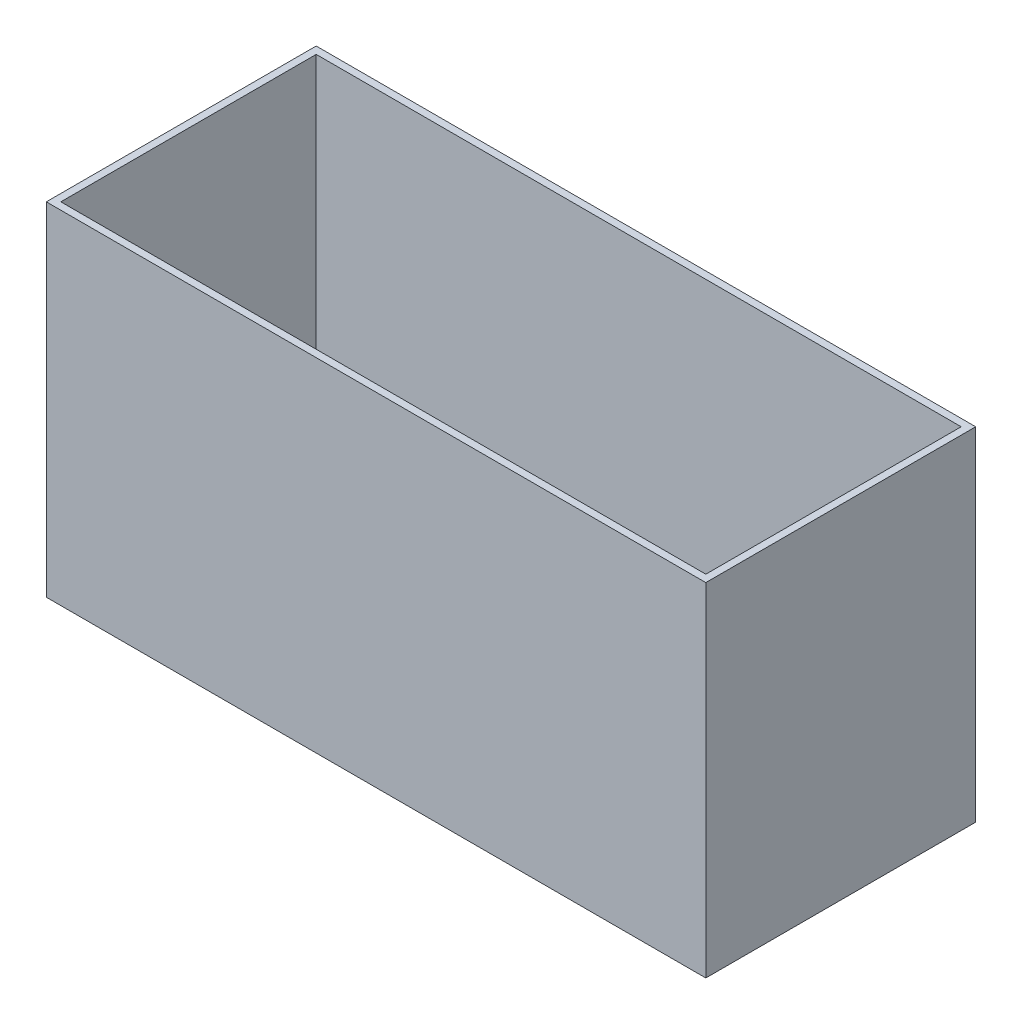
ISO-10303-21;
HEADER;
FILE_DESCRIPTION(('STEP AP214'),'2;1');
FILE_NAME('part.step','',(''),(''),'','','');
FILE_SCHEMA(('AUTOMOTIVE_DESIGN { 1 0 10303 214 1 1 1 1 }'));
ENDSEC;
DATA;
#1=APPLICATION_CONTEXT('core data for automotive mechanical design processes');
#2=APPLICATION_PROTOCOL_DEFINITION('international standard','automotive_design',2000,#1);
#3=PRODUCT_CONTEXT('',#1,'mechanical');
#4=PRODUCT('Part','Part','',(#3));
#5=PRODUCT_RELATED_PRODUCT_CATEGORY('part','',(#4));
#6=PRODUCT_DEFINITION_FORMATION('','',#4);
#7=PRODUCT_DEFINITION_CONTEXT('part definition',#1,'design');
#8=PRODUCT_DEFINITION('design','',#6,#7);
#9=PRODUCT_DEFINITION_SHAPE('','',#8);
#10=(LENGTH_UNIT() NAMED_UNIT(*) SI_UNIT(.MILLI.,.METRE.));
#11=(NAMED_UNIT(*) PLANE_ANGLE_UNIT() SI_UNIT($,.RADIAN.));
#12=(NAMED_UNIT(*) SI_UNIT($,.STERADIAN.) SOLID_ANGLE_UNIT());
#13=UNCERTAINTY_MEASURE_WITH_UNIT(LENGTH_MEASURE(1.E-05),#10,'distance_accuracy_value','');
#14=(GEOMETRIC_REPRESENTATION_CONTEXT(3) GLOBAL_UNCERTAINTY_ASSIGNED_CONTEXT((#13)) GLOBAL_UNIT_ASSIGNED_CONTEXT((#10,
#11,#12)) REPRESENTATION_CONTEXT('',''));
#15=CARTESIAN_POINT('',(0.,0.,0.));
#16=DIRECTION('',(0.,0.,1.));
#17=DIRECTION('',(1.,0.,0.));
#18=AXIS2_PLACEMENT_3D('',#15,#16,#17);
#19=CARTESIAN_POINT('',(0.,10.,0.));
#20=DIRECTION('',(0.,-1.,0.));
#21=DIRECTION('',(0.,0.,-1.));
#22=AXIS2_PLACEMENT_3D('',#19,#20,#21);
#23=PLANE('',#22);
#24=DIRECTION('',(0.,0.,-1.));
#25=VECTOR('',#24,1.);
#26=CARTESIAN_POINT('',(-444.5,10.,0.));
#27=LINE('',#26,#25);
#28=CARTESIAN_POINT('',(-444.5,10.0000000000002,176.));
#29=VERTEX_POINT('',#28);
#30=CARTESIAN_POINT('',(-444.5,10.0000000000002,-176.));
#31=VERTEX_POINT('',#30);
#32=EDGE_CURVE('E130',#29,#31,#27,.T.);
#33=ORIENTED_EDGE('',*,*,#32,.F.);
#34=DIRECTION('',(-1.,0.,0.));
#35=VECTOR('',#34,1.);
#36=CARTESIAN_POINT('',(0.,10.,176.));
#37=LINE('',#36,#35);
#38=CARTESIAN_POINT('',(444.5,10.0000000000002,176.));
#39=VERTEX_POINT('',#38);
#40=EDGE_CURVE('E188',#39,#29,#37,.T.);
#41=ORIENTED_EDGE('',*,*,#40,.F.);
#42=DIRECTION('',(0.,0.,1.));
#43=VECTOR('',#42,1.);
#44=CARTESIAN_POINT('',(444.5,10.,0.));
#45=LINE('',#44,#43);
#46=CARTESIAN_POINT('',(444.5,10.0000000000002,-176.));
#47=VERTEX_POINT('',#46);
#48=EDGE_CURVE('E194',#47,#39,#45,.T.);
#49=ORIENTED_EDGE('',*,*,#48,.F.);
#50=DIRECTION('',(1.,0.,0.));
#51=VECTOR('',#50,1.);
#52=CARTESIAN_POINT('',(0.,10.,-176.));
#53=LINE('',#52,#51);
#54=EDGE_CURVE('E140',#31,#47,#53,.T.);
#55=ORIENTED_EDGE('',*,*,#54,.F.);
#56=EDGE_LOOP('',(#33,#41,#49,#55));
#57=FACE_BOUND('',#56,.T.);
#58=ADVANCED_FACE('F45',(#57),#23,.F.);
#59=CARTESIAN_POINT('',(-454.5,472.,-176.));
#60=DIRECTION('',(0.,0.,-1.));
#61=DIRECTION('',(-1.,0.,0.));
#62=AXIS2_PLACEMENT_3D('',#59,#60,#61);
#63=PLANE('',#62);
#64=DIRECTION('',(0.,-1.,0.));
#65=VECTOR('',#64,1.);
#66=CARTESIAN_POINT('',(-444.5,472.,-176.));
#67=LINE('',#66,#65);
#68=CARTESIAN_POINT('',(-444.5,472.,-176.));
#69=VERTEX_POINT('',#68);
#70=EDGE_CURVE('E127',#69,#31,#67,.T.);
#71=ORIENTED_EDGE('',*,*,#70,.T.);
#72=ORIENTED_EDGE('',*,*,#54,.T.);
#73=DIRECTION('',(0.,-1.,0.));
#74=VECTOR('',#73,1.);
#75=CARTESIAN_POINT('',(444.5,472.,-176.));
#76=LINE('',#75,#74);
#77=CARTESIAN_POINT('',(444.5,472.,-176.));
#78=VERTEX_POINT('',#77);
#79=EDGE_CURVE('E138',#78,#47,#76,.T.);
#80=ORIENTED_EDGE('',*,*,#79,.F.);
#81=DIRECTION('',(1.,0.,0.));
#82=VECTOR('',#81,1.);
#83=CARTESIAN_POINT('',(-454.5,472.,-176.));
#84=LINE('',#83,#82);
#85=EDGE_CURVE('E118',#69,#78,#84,.T.);
#86=ORIENTED_EDGE('',*,*,#85,.F.);
#87=EDGE_LOOP('',(#71,#72,#80,#86));
#88=FACE_BOUND('',#87,.T.);
#89=ADVANCED_FACE('F136',(#88),#63,.F.);
#90=CARTESIAN_POINT('',(-454.5,472.,176.));
#91=DIRECTION('',(0.,0.,1.));
#92=DIRECTION('',(1.,0.,0.));
#93=AXIS2_PLACEMENT_3D('',#90,#91,#92);
#94=PLANE('',#93);
#95=DIRECTION('',(0.,-1.,0.));
#96=VECTOR('',#95,1.);
#97=CARTESIAN_POINT('',(-444.5,472.,176.));
#98=LINE('',#97,#96);
#99=CARTESIAN_POINT('',(-444.5,472.,176.));
#100=VERTEX_POINT('',#99);
#101=EDGE_CURVE('E124',#100,#29,#98,.T.);
#102=ORIENTED_EDGE('',*,*,#101,.F.);
#103=DIRECTION('',(-1.,0.,0.));
#104=VECTOR('',#103,1.);
#105=CARTESIAN_POINT('',(-454.5,472.,176.));
#106=LINE('',#105,#104);
#107=CARTESIAN_POINT('',(444.5,472.,176.));
#108=VERTEX_POINT('',#107);
#109=EDGE_CURVE('E120',#108,#100,#106,.T.);
#110=ORIENTED_EDGE('',*,*,#109,.F.);
#111=DIRECTION('',(0.,-1.,0.));
#112=VECTOR('',#111,1.);
#113=CARTESIAN_POINT('',(444.5,472.,176.));
#114=LINE('',#113,#112);
#115=EDGE_CURVE('E61',#108,#39,#114,.T.);
#116=ORIENTED_EDGE('',*,*,#115,.T.);
#117=ORIENTED_EDGE('',*,*,#40,.T.);
#118=EDGE_LOOP('',(#102,#110,#116,#117));
#119=FACE_BOUND('',#118,.T.);
#120=ADVANCED_FACE('F208',(#119),#94,.F.);
#121=CARTESIAN_POINT('',(454.5,10.,186.));
#122=DIRECTION('',(-1.,0.,0.));
#123=DIRECTION('',(0.,0.,1.));
#124=AXIS2_PLACEMENT_3D('',#121,#122,#123);
#125=PLANE('',#124);
#126=DIRECTION('',(0.,0.,-1.));
#127=VECTOR('',#126,1.);
#128=CARTESIAN_POINT('',(454.5,0.,186.));
#129=LINE('',#128,#127);
#130=CARTESIAN_POINT('',(454.5,0.,186.));
#131=VERTEX_POINT('',#130);
#132=CARTESIAN_POINT('',(454.5,0.,-186.));
#133=VERTEX_POINT('',#132);
#134=EDGE_CURVE('E145',#131,#133,#129,.T.);
#135=ORIENTED_EDGE('',*,*,#134,.T.);
#136=DIRECTION('',(0.,-1.,0.));
#137=VECTOR('',#136,1.);
#138=CARTESIAN_POINT('',(454.5,10.,-186.));
#139=LINE('',#138,#137);
#140=CARTESIAN_POINT('',(454.5,472.,-186.));
#141=VERTEX_POINT('',#140);
#142=EDGE_CURVE('E11',#141,#133,#139,.T.);
#143=ORIENTED_EDGE('',*,*,#142,.F.);
#144=DIRECTION('',(0.,0.,-1.));
#145=VECTOR('',#144,1.);
#146=CARTESIAN_POINT('',(454.5,472.,-176.));
#147=LINE('',#146,#145);
#148=CARTESIAN_POINT('',(454.5,472.,186.));
#149=VERTEX_POINT('',#148);
#150=EDGE_CURVE('E182',#149,#141,#147,.T.);
#151=ORIENTED_EDGE('',*,*,#150,.F.);
#152=DIRECTION('',(0.,-1.,0.));
#153=VECTOR('',#152,1.);
#154=CARTESIAN_POINT('',(454.5,10.,186.));
#155=LINE('',#154,#153);
#156=EDGE_CURVE('E161',#149,#131,#155,.T.);
#157=ORIENTED_EDGE('',*,*,#156,.T.);
#158=EDGE_LOOP('',(#135,#143,#151,#157));
#159=FACE_BOUND('',#158,.T.);
#160=ADVANCED_FACE('F47',(#159),#125,.F.);
#161=CARTESIAN_POINT('',(-454.5,10.,-186.));
#162=DIRECTION('',(0.,0.,1.));
#163=DIRECTION('',(1.,0.,0.));
#164=AXIS2_PLACEMENT_3D('',#161,#162,#163);
#165=PLANE('',#164);
#166=DIRECTION('',(-1.,0.,0.));
#167=VECTOR('',#166,1.);
#168=CARTESIAN_POINT('',(-454.5,0.,-186.));
#169=LINE('',#168,#167);
#170=CARTESIAN_POINT('',(-454.5,0.,-186.));
#171=VERTEX_POINT('',#170);
#172=EDGE_CURVE('E153',#133,#171,#169,.T.);
#173=ORIENTED_EDGE('',*,*,#172,.T.);
#174=DIRECTION('',(0.,-1.,0.));
#175=VECTOR('',#174,1.);
#176=CARTESIAN_POINT('',(-454.5,10.,-186.));
#177=LINE('',#176,#175);
#178=CARTESIAN_POINT('',(-454.5,472.,-186.));
#179=VERTEX_POINT('',#178);
#180=EDGE_CURVE('E54',#179,#171,#177,.T.);
#181=ORIENTED_EDGE('',*,*,#180,.F.);
#182=DIRECTION('',(-1.,0.,0.));
#183=VECTOR('',#182,1.);
#184=CARTESIAN_POINT('',(-454.5,472.,-186.));
#185=LINE('',#184,#183);
#186=EDGE_CURVE('E147',#141,#179,#185,.T.);
#187=ORIENTED_EDGE('',*,*,#186,.F.);
#188=ORIENTED_EDGE('',*,*,#142,.T.);
#189=EDGE_LOOP('',(#173,#181,#187,#188));
#190=FACE_BOUND('',#189,.T.);
#191=ADVANCED_FACE('F200',(#190),#165,.F.);
#192=CARTESIAN_POINT('',(-454.5,10.,186.));
#193=DIRECTION('',(1.,0.,0.));
#194=DIRECTION('',(0.,0.,-1.));
#195=AXIS2_PLACEMENT_3D('',#192,#193,#194);
#196=PLANE('',#195);
#197=DIRECTION('',(0.,-1.,0.));
#198=VECTOR('',#197,1.);
#199=CARTESIAN_POINT('',(-454.5,10.,186.));
#200=LINE('',#199,#198);
#201=CARTESIAN_POINT('',(-454.5,472.,186.));
#202=VERTEX_POINT('',#201);
#203=CARTESIAN_POINT('',(-454.5,0.,186.));
#204=VERTEX_POINT('',#203);
#205=EDGE_CURVE('E164',#202,#204,#200,.T.);
#206=ORIENTED_EDGE('',*,*,#205,.F.);
#207=DIRECTION('',(0.,0.,1.));
#208=VECTOR('',#207,1.);
#209=CARTESIAN_POINT('',(-454.5,472.,-176.));
#210=LINE('',#209,#208);
#211=EDGE_CURVE('E141',#179,#202,#210,.T.);
#212=ORIENTED_EDGE('',*,*,#211,.F.);
#213=ORIENTED_EDGE('',*,*,#180,.T.);
#214=DIRECTION('',(0.,0.,1.));
#215=VECTOR('',#214,1.);
#216=CARTESIAN_POINT('',(-454.5,0.,186.));
#217=LINE('',#216,#215);
#218=EDGE_CURVE('E156',#171,#204,#217,.T.);
#219=ORIENTED_EDGE('',*,*,#218,.T.);
#220=EDGE_LOOP('',(#206,#212,#213,#219));
#221=FACE_BOUND('',#220,.T.);
#222=ADVANCED_FACE('F172',(#221),#196,.F.);
#223=CARTESIAN_POINT('',(-454.5,10.,186.));
#224=DIRECTION('',(0.,0.,-1.));
#225=DIRECTION('',(-1.,0.,0.));
#226=AXIS2_PLACEMENT_3D('',#223,#224,#225);
#227=PLANE('',#226);
#228=DIRECTION('',(1.,0.,0.));
#229=VECTOR('',#228,1.);
#230=CARTESIAN_POINT('',(-454.5,0.,186.));
#231=LINE('',#230,#229);
#232=EDGE_CURVE('E69',#204,#131,#231,.T.);
#233=ORIENTED_EDGE('',*,*,#232,.T.);
#234=ORIENTED_EDGE('',*,*,#156,.F.);
#235=DIRECTION('',(1.,0.,0.));
#236=VECTOR('',#235,1.);
#237=CARTESIAN_POINT('',(-454.5,472.,186.));
#238=LINE('',#237,#236);
#239=EDGE_CURVE('E186',#202,#149,#238,.T.);
#240=ORIENTED_EDGE('',*,*,#239,.F.);
#241=ORIENTED_EDGE('',*,*,#205,.T.);
#242=EDGE_LOOP('',(#233,#234,#240,#241));
#243=FACE_BOUND('',#242,.T.);
#244=ADVANCED_FACE('F185',(#243),#227,.F.);
#245=CARTESIAN_POINT('',(0.,0.,0.));
#246=DIRECTION('',(0.,-1.,0.));
#247=DIRECTION('',(0.,0.,-1.));
#248=AXIS2_PLACEMENT_3D('',#245,#246,#247);
#249=PLANE('',#248);
#250=ORIENTED_EDGE('',*,*,#232,.F.);
#251=ORIENTED_EDGE('',*,*,#218,.F.);
#252=ORIENTED_EDGE('',*,*,#172,.F.);
#253=ORIENTED_EDGE('',*,*,#134,.F.);
#254=EDGE_LOOP('',(#250,#251,#252,#253));
#255=FACE_BOUND('',#254,.T.);
#256=ADVANCED_FACE('F178',(#255),#249,.T.);
#257=CARTESIAN_POINT('',(0.,472.,0.));
#258=DIRECTION('',(0.,-1.,0.));
#259=DIRECTION('',(0.,0.,-1.));
#260=AXIS2_PLACEMENT_3D('',#257,#258,#259);
#261=PLANE('',#260);
#262=DIRECTION('',(0.,0.,-1.));
#263=VECTOR('',#262,1.);
#264=CARTESIAN_POINT('',(-444.5,472.,176.));
#265=LINE('',#264,#263);
#266=EDGE_CURVE('E113',#100,#69,#265,.T.);
#267=ORIENTED_EDGE('',*,*,#266,.T.);
#268=ORIENTED_EDGE('',*,*,#85,.T.);
#269=DIRECTION('',(0.,0.,1.));
#270=VECTOR('',#269,1.);
#271=CARTESIAN_POINT('',(444.5,472.,176.));
#272=LINE('',#271,#270);
#273=EDGE_CURVE('E330',#78,#108,#272,.T.);
#274=ORIENTED_EDGE('',*,*,#273,.T.);
#275=ORIENTED_EDGE('',*,*,#109,.T.);
#276=EDGE_LOOP('',(#267,#268,#274,#275));
#277=FACE_BOUND('',#276,.T.);
#278=ORIENTED_EDGE('',*,*,#150,.T.);
#279=ORIENTED_EDGE('',*,*,#186,.T.);
#280=ORIENTED_EDGE('',*,*,#211,.T.);
#281=ORIENTED_EDGE('',*,*,#239,.T.);
#282=EDGE_LOOP('',(#278,#279,#280,#281));
#283=FACE_BOUND('',#282,.T.);
#284=ADVANCED_FACE('F115',(#277,#283),#261,.F.);
#285=CARTESIAN_POINT('',(444.5,472.,176.));
#286=DIRECTION('',(1.,0.,0.));
#287=DIRECTION('',(0.,0.,-1.));
#288=AXIS2_PLACEMENT_3D('',#285,#286,#287);
#289=PLANE('',#288);
#290=ORIENTED_EDGE('',*,*,#79,.T.);
#291=ORIENTED_EDGE('',*,*,#48,.T.);
#292=ORIENTED_EDGE('',*,*,#115,.F.);
#293=ORIENTED_EDGE('',*,*,#273,.F.);
#294=EDGE_LOOP('',(#290,#291,#292,#293));
#295=FACE_BOUND('',#294,.T.);
#296=ADVANCED_FACE('F234',(#295),#289,.F.);
#297=CARTESIAN_POINT('',(-444.5,472.,176.));
#298=DIRECTION('',(-1.,0.,0.));
#299=DIRECTION('',(0.,0.,1.));
#300=AXIS2_PLACEMENT_3D('',#297,#298,#299);
#301=PLANE('',#300);
#302=ORIENTED_EDGE('',*,*,#101,.T.);
#303=ORIENTED_EDGE('',*,*,#32,.T.);
#304=ORIENTED_EDGE('',*,*,#70,.F.);
#305=ORIENTED_EDGE('',*,*,#266,.F.);
#306=EDGE_LOOP('',(#302,#303,#304,#305));
#307=FACE_BOUND('',#306,.T.);
#308=ADVANCED_FACE('F128',(#307),#301,.F.);
#309=CLOSED_SHELL('',(#58,#89,#120,#160,#191,#222,#244,#256,#284,#296,#308));
#310=MANIFOLD_SOLID_BREP('B2',#309);
#311=ADVANCED_BREP_SHAPE_REPRESENTATION('',(#18,#310),#14);
#312=SHAPE_DEFINITION_REPRESENTATION(#9,#311);
ENDSEC;
END-ISO-10303-21;
